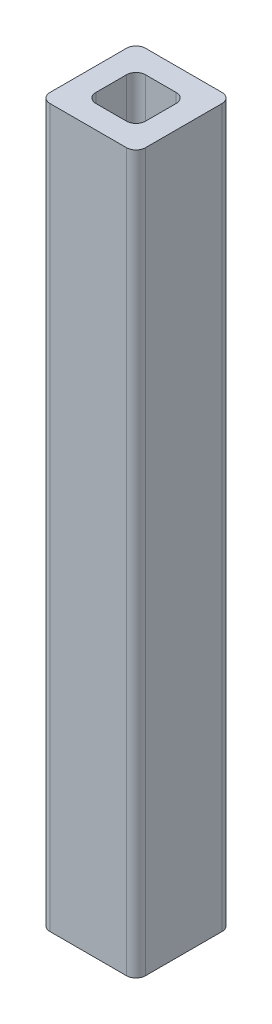
ISO-10303-21;
HEADER;
FILE_DESCRIPTION(('STEP AP214'),'2;1');
FILE_NAME('part.step','',(''),(''),'','','');
FILE_SCHEMA(('AUTOMOTIVE_DESIGN { 1 0 10303 214 1 1 1 1 }'));
ENDSEC;
DATA;
#1=APPLICATION_CONTEXT('core data for automotive mechanical design processes');
#2=APPLICATION_PROTOCOL_DEFINITION('international standard','automotive_design',2000,#1);
#3=PRODUCT_CONTEXT('',#1,'mechanical');
#4=PRODUCT('Part','Part','',(#3));
#5=PRODUCT_RELATED_PRODUCT_CATEGORY('part','',(#4));
#6=PRODUCT_DEFINITION_FORMATION('','',#4);
#7=PRODUCT_DEFINITION_CONTEXT('part definition',#1,'design');
#8=PRODUCT_DEFINITION('design','',#6,#7);
#9=PRODUCT_DEFINITION_SHAPE('','',#8);
#10=(LENGTH_UNIT() NAMED_UNIT(*) SI_UNIT(.MILLI.,.METRE.));
#11=(NAMED_UNIT(*) PLANE_ANGLE_UNIT() SI_UNIT($,.RADIAN.));
#12=(NAMED_UNIT(*) SI_UNIT($,.STERADIAN.) SOLID_ANGLE_UNIT());
#13=UNCERTAINTY_MEASURE_WITH_UNIT(LENGTH_MEASURE(1.E-05),#10,'distance_accuracy_value','');
#14=(GEOMETRIC_REPRESENTATION_CONTEXT(3) GLOBAL_UNCERTAINTY_ASSIGNED_CONTEXT((#13)) GLOBAL_UNIT_ASSIGNED_CONTEXT((#10,
#11,#12)) REPRESENTATION_CONTEXT('',''));
#15=CARTESIAN_POINT('',(0.,0.,0.));
#16=DIRECTION('',(0.,0.,1.));
#17=DIRECTION('',(1.,0.,0.));
#18=AXIS2_PLACEMENT_3D('',#15,#16,#17);
#19=CARTESIAN_POINT('',(4.,75.,-4.));
#20=DIRECTION('',(0.,-1.,0.));
#21=DIRECTION('',(0.,0.,-1.));
#22=AXIS2_PLACEMENT_3D('',#19,#20,#21);
#23=CYLINDRICAL_SURFACE('',#22,1.);
#24=CARTESIAN_POINT('',(4.,0.,-4.));
#25=DIRECTION('',(0.,1.,0.));
#26=DIRECTION('',(0.,0.,-1.));
#27=AXIS2_PLACEMENT_3D('',#24,#25,#26);
#28=CIRCLE('',#27,1.);
#29=CARTESIAN_POINT('',(5.,0.,-3.99999999999999));
#30=VERTEX_POINT('',#29);
#31=CARTESIAN_POINT('',(3.99999999999999,0.,-5.));
#32=VERTEX_POINT('',#31);
#33=EDGE_CURVE('E141',#30,#32,#28,.T.);
#34=ORIENTED_EDGE('',*,*,#33,.T.);
#35=DIRECTION('',(0.,-1.,0.));
#36=VECTOR('',#35,1.);
#37=CARTESIAN_POINT('',(3.99999999999999,75.,-5.));
#38=LINE('',#37,#36);
#39=CARTESIAN_POINT('',(3.99999999999999,75.,-5.));
#40=VERTEX_POINT('',#39);
#41=EDGE_CURVE('E11',#40,#32,#38,.T.);
#42=ORIENTED_EDGE('',*,*,#41,.F.);
#43=CARTESIAN_POINT('',(4.,75.,-4.));
#44=DIRECTION('',(0.,1.,0.));
#45=DIRECTION('',(0.,0.,-1.));
#46=AXIS2_PLACEMENT_3D('',#43,#44,#45);
#47=CIRCLE('',#46,1.);
#48=CARTESIAN_POINT('',(5.,75.,-3.99999999999999));
#49=VERTEX_POINT('',#48);
#50=EDGE_CURVE('E157',#49,#40,#47,.T.);
#51=ORIENTED_EDGE('',*,*,#50,.F.);
#52=DIRECTION('',(0.,-1.,0.));
#53=VECTOR('',#52,1.);
#54=CARTESIAN_POINT('',(5.,75.,-3.99999999999999));
#55=LINE('',#54,#53);
#56=EDGE_CURVE('E137',#49,#30,#55,.T.);
#57=ORIENTED_EDGE('',*,*,#56,.T.);
#58=EDGE_LOOP('',(#34,#42,#51,#57));
#59=FACE_BOUND('',#58,.T.);
#60=ADVANCED_FACE('F33',(#59),#23,.T.);
#61=CARTESIAN_POINT('',(-3.99999999999999,75.,-5.));
#62=DIRECTION('',(0.,0.,1.));
#63=DIRECTION('',(1.,0.,0.));
#64=AXIS2_PLACEMENT_3D('',#61,#62,#63);
#65=PLANE('',#64);
#66=DIRECTION('',(-1.,0.,0.));
#67=VECTOR('',#66,1.);
#68=CARTESIAN_POINT('',(-3.99999999999999,0.,-5.));
#69=LINE('',#68,#67);
#70=CARTESIAN_POINT('',(-3.99999999999999,0.,-5.));
#71=VERTEX_POINT('',#70);
#72=EDGE_CURVE('E144',#32,#71,#69,.T.);
#73=ORIENTED_EDGE('',*,*,#72,.T.);
#74=DIRECTION('',(0.,-1.,0.));
#75=VECTOR('',#74,1.);
#76=CARTESIAN_POINT('',(-3.99999999999999,75.,-5.));
#77=LINE('',#76,#75);
#78=CARTESIAN_POINT('',(-3.99999999999999,75.,-5.));
#79=VERTEX_POINT('',#78);
#80=EDGE_CURVE('E40',#79,#71,#77,.T.);
#81=ORIENTED_EDGE('',*,*,#80,.F.);
#82=DIRECTION('',(-1.,0.,0.));
#83=VECTOR('',#82,1.);
#84=CARTESIAN_POINT('',(-3.99999999999999,75.,-5.));
#85=LINE('',#84,#83);
#86=EDGE_CURVE('E97',#40,#79,#85,.T.);
#87=ORIENTED_EDGE('',*,*,#86,.F.);
#88=ORIENTED_EDGE('',*,*,#41,.T.);
#89=EDGE_LOOP('',(#73,#81,#87,#88));
#90=FACE_BOUND('',#89,.T.);
#91=ADVANCED_FACE('F331',(#90),#65,.F.);
#92=CARTESIAN_POINT('',(-4.,75.,-4.));
#93=DIRECTION('',(0.,-1.,0.));
#94=DIRECTION('',(0.,0.,-1.));
#95=AXIS2_PLACEMENT_3D('',#92,#93,#94);
#96=CYLINDRICAL_SURFACE('',#95,1.);
#97=CARTESIAN_POINT('',(-4.,0.,-4.));
#98=DIRECTION('',(0.,1.,0.));
#99=DIRECTION('',(0.,0.,-1.));
#100=AXIS2_PLACEMENT_3D('',#97,#98,#99);
#101=CIRCLE('',#100,1.);
#102=CARTESIAN_POINT('',(-5.,0.,-3.99999999999999));
#103=VERTEX_POINT('',#102);
#104=EDGE_CURVE('E147',#71,#103,#101,.T.);
#105=ORIENTED_EDGE('',*,*,#104,.T.);
#106=DIRECTION('',(0.,-1.,0.));
#107=VECTOR('',#106,1.);
#108=CARTESIAN_POINT('',(-5.,75.,-3.99999999999999));
#109=LINE('',#108,#107);
#110=CARTESIAN_POINT('',(-5.,75.,-3.99999999999999));
#111=VERTEX_POINT('',#110);
#112=EDGE_CURVE('E164',#111,#103,#109,.T.);
#113=ORIENTED_EDGE('',*,*,#112,.F.);
#114=CARTESIAN_POINT('',(-4.,75.,-4.));
#115=DIRECTION('',(0.,1.,0.));
#116=DIRECTION('',(0.,0.,-1.));
#117=AXIS2_PLACEMENT_3D('',#114,#115,#116);
#118=CIRCLE('',#117,1.);
#119=EDGE_CURVE('E172',#79,#111,#118,.T.);
#120=ORIENTED_EDGE('',*,*,#119,.F.);
#121=ORIENTED_EDGE('',*,*,#80,.T.);
#122=EDGE_LOOP('',(#105,#113,#120,#121));
#123=FACE_BOUND('',#122,.T.);
#124=ADVANCED_FACE('F170',(#123),#96,.T.);
#125=CARTESIAN_POINT('',(-5.,75.,3.99999999999999));
#126=DIRECTION('',(1.,0.,0.));
#127=DIRECTION('',(0.,0.,-1.));
#128=AXIS2_PLACEMENT_3D('',#125,#126,#127);
#129=PLANE('',#128);
#130=DIRECTION('',(0.,0.,1.));
#131=VECTOR('',#130,1.);
#132=CARTESIAN_POINT('',(-5.,0.,3.99999999999999));
#133=LINE('',#132,#131);
#134=CARTESIAN_POINT('',(-5.,0.,3.99999999999999));
#135=VERTEX_POINT('',#134);
#136=EDGE_CURVE('E149',#103,#135,#133,.T.);
#137=ORIENTED_EDGE('',*,*,#136,.T.);
#138=DIRECTION('',(0.,-1.,0.));
#139=VECTOR('',#138,1.);
#140=CARTESIAN_POINT('',(-5.,75.,3.99999999999999));
#141=LINE('',#140,#139);
#142=CARTESIAN_POINT('',(-5.,75.,3.99999999999999));
#143=VERTEX_POINT('',#142);
#144=EDGE_CURVE('E161',#143,#135,#141,.T.);
#145=ORIENTED_EDGE('',*,*,#144,.F.);
#146=DIRECTION('',(0.,0.,1.));
#147=VECTOR('',#146,1.);
#148=CARTESIAN_POINT('',(-5.,75.,3.99999999999999));
#149=LINE('',#148,#147);
#150=EDGE_CURVE('E184',#111,#143,#149,.T.);
#151=ORIENTED_EDGE('',*,*,#150,.F.);
#152=ORIENTED_EDGE('',*,*,#112,.T.);
#153=EDGE_LOOP('',(#137,#145,#151,#152));
#154=FACE_BOUND('',#153,.T.);
#155=ADVANCED_FACE('F180',(#154),#129,.F.);
#156=CARTESIAN_POINT('',(-4.,75.,4.));
#157=DIRECTION('',(0.,-1.,0.));
#158=DIRECTION('',(0.,0.,-1.));
#159=AXIS2_PLACEMENT_3D('',#156,#157,#158);
#160=CYLINDRICAL_SURFACE('',#159,1.);
#161=CARTESIAN_POINT('',(-4.,0.,4.));
#162=DIRECTION('',(0.,1.,0.));
#163=DIRECTION('',(0.,0.,-1.));
#164=AXIS2_PLACEMENT_3D('',#161,#162,#163);
#165=CIRCLE('',#164,1.);
#166=CARTESIAN_POINT('',(-3.99999999999999,0.,5.));
#167=VERTEX_POINT('',#166);
#168=EDGE_CURVE('E151',#135,#167,#165,.T.);
#169=ORIENTED_EDGE('',*,*,#168,.T.);
#170=DIRECTION('',(0.,-1.,0.));
#171=VECTOR('',#170,1.);
#172=CARTESIAN_POINT('',(-3.99999999999999,75.,5.));
#173=LINE('',#172,#171);
#174=CARTESIAN_POINT('',(-3.99999999999999,75.,5.));
#175=VERTEX_POINT('',#174);
#176=EDGE_CURVE('E132',#175,#167,#173,.T.);
#177=ORIENTED_EDGE('',*,*,#176,.F.);
#178=CARTESIAN_POINT('',(-4.,75.,4.));
#179=DIRECTION('',(0.,1.,0.));
#180=DIRECTION('',(0.,0.,-1.));
#181=AXIS2_PLACEMENT_3D('',#178,#179,#180);
#182=CIRCLE('',#181,1.);
#183=EDGE_CURVE('E120',#143,#175,#182,.T.);
#184=ORIENTED_EDGE('',*,*,#183,.F.);
#185=ORIENTED_EDGE('',*,*,#144,.T.);
#186=EDGE_LOOP('',(#169,#177,#184,#185));
#187=FACE_BOUND('',#186,.T.);
#188=ADVANCED_FACE('F183',(#187),#160,.T.);
#189=CARTESIAN_POINT('',(-3.99999999999999,75.,5.));
#190=DIRECTION('',(0.,0.,-1.));
#191=DIRECTION('',(-1.,0.,0.));
#192=AXIS2_PLACEMENT_3D('',#189,#190,#191);
#193=PLANE('',#192);
#194=DIRECTION('',(1.,0.,0.));
#195=VECTOR('',#194,1.);
#196=CARTESIAN_POINT('',(-3.99999999999999,0.,5.));
#197=LINE('',#196,#195);
#198=CARTESIAN_POINT('',(3.99999999999999,0.,5.));
#199=VERTEX_POINT('',#198);
#200=EDGE_CURVE('E129',#167,#199,#197,.T.);
#201=ORIENTED_EDGE('',*,*,#200,.T.);
#202=DIRECTION('',(0.,-1.,0.));
#203=VECTOR('',#202,1.);
#204=CARTESIAN_POINT('',(3.99999999999999,75.,5.));
#205=LINE('',#204,#203);
#206=CARTESIAN_POINT('',(3.99999999999999,75.,5.));
#207=VERTEX_POINT('',#206);
#208=EDGE_CURVE('E126',#207,#199,#205,.T.);
#209=ORIENTED_EDGE('',*,*,#208,.F.);
#210=DIRECTION('',(1.,0.,0.));
#211=VECTOR('',#210,1.);
#212=CARTESIAN_POINT('',(-3.99999999999999,75.,5.));
#213=LINE('',#212,#211);
#214=EDGE_CURVE('E113',#175,#207,#213,.T.);
#215=ORIENTED_EDGE('',*,*,#214,.F.);
#216=ORIENTED_EDGE('',*,*,#176,.T.);
#217=EDGE_LOOP('',(#201,#209,#215,#216));
#218=FACE_BOUND('',#217,.T.);
#219=ADVANCED_FACE('F127',(#218),#193,.F.);
#220=CARTESIAN_POINT('',(4.,75.,4.));
#221=DIRECTION('',(0.,-1.,0.));
#222=DIRECTION('',(0.,0.,-1.));
#223=AXIS2_PLACEMENT_3D('',#220,#221,#222);
#224=CYLINDRICAL_SURFACE('',#223,1.);
#225=CARTESIAN_POINT('',(4.,0.,4.));
#226=DIRECTION('',(0.,1.,0.));
#227=DIRECTION('',(0.,0.,1.));
#228=AXIS2_PLACEMENT_3D('',#225,#226,#227);
#229=CIRCLE('',#228,1.);
#230=CARTESIAN_POINT('',(5.,0.,3.99999999999999));
#231=VERTEX_POINT('',#230);
#232=EDGE_CURVE('E154',#199,#231,#229,.T.);
#233=ORIENTED_EDGE('',*,*,#232,.T.);
#234=DIRECTION('',(0.,-1.,0.));
#235=VECTOR('',#234,1.);
#236=CARTESIAN_POINT('',(5.,75.,3.99999999999999));
#237=LINE('',#236,#235);
#238=CARTESIAN_POINT('',(5.,75.,3.99999999999999));
#239=VERTEX_POINT('',#238);
#240=EDGE_CURVE('E133',#239,#231,#237,.T.);
#241=ORIENTED_EDGE('',*,*,#240,.F.);
#242=CARTESIAN_POINT('',(4.,75.,4.));
#243=DIRECTION('',(0.,1.,0.));
#244=DIRECTION('',(0.,0.,1.));
#245=AXIS2_PLACEMENT_3D('',#242,#243,#244);
#246=CIRCLE('',#245,1.);
#247=EDGE_CURVE('E117',#207,#239,#246,.T.);
#248=ORIENTED_EDGE('',*,*,#247,.F.);
#249=ORIENTED_EDGE('',*,*,#208,.T.);
#250=EDGE_LOOP('',(#233,#241,#248,#249));
#251=FACE_BOUND('',#250,.T.);
#252=ADVANCED_FACE('F135',(#251),#224,.T.);
#253=CARTESIAN_POINT('',(5.,75.,3.99999999999999));
#254=DIRECTION('',(-1.,0.,0.));
#255=DIRECTION('',(0.,0.,1.));
#256=AXIS2_PLACEMENT_3D('',#253,#254,#255);
#257=PLANE('',#256);
#258=DIRECTION('',(0.,0.,-1.));
#259=VECTOR('',#258,1.);
#260=CARTESIAN_POINT('',(5.,0.,3.99999999999999));
#261=LINE('',#260,#259);
#262=EDGE_CURVE('E89',#231,#30,#261,.T.);
#263=ORIENTED_EDGE('',*,*,#262,.T.);
#264=ORIENTED_EDGE('',*,*,#56,.F.);
#265=DIRECTION('',(0.,0.,-1.));
#266=VECTOR('',#265,1.);
#267=CARTESIAN_POINT('',(5.,75.,3.99999999999999));
#268=LINE('',#267,#266);
#269=EDGE_CURVE('E56',#239,#49,#268,.T.);
#270=ORIENTED_EDGE('',*,*,#269,.F.);
#271=ORIENTED_EDGE('',*,*,#240,.T.);
#272=EDGE_LOOP('',(#263,#264,#270,#271));
#273=FACE_BOUND('',#272,.T.);
#274=ADVANCED_FACE('F338',(#273),#257,.F.);
#275=CARTESIAN_POINT('',(4.,75.,-4.));
#276=DIRECTION('',(0.,-1.,0.));
#277=DIRECTION('',(0.,0.,-1.));
#278=AXIS2_PLACEMENT_3D('',#275,#276,#277);
#279=PLANE('',#278);
#280=DIRECTION('',(1.,0.,0.));
#281=VECTOR('',#280,1.);
#282=CARTESIAN_POINT('',(-1.6,75.,2.6));
#283=LINE('',#282,#281);
#284=CARTESIAN_POINT('',(-1.6,75.,2.6));
#285=VERTEX_POINT('',#284);
#286=CARTESIAN_POINT('',(1.6,75.,2.6));
#287=VERTEX_POINT('',#286);
#288=EDGE_CURVE('E231',#285,#287,#283,.T.);
#289=ORIENTED_EDGE('',*,*,#288,.F.);
#290=CARTESIAN_POINT('',(-1.6,75.,1.6));
#291=DIRECTION('',(0.,1.,0.));
#292=DIRECTION('',(0.,0.,-1.));
#293=AXIS2_PLACEMENT_3D('',#290,#291,#292);
#294=CIRCLE('',#293,1.);
#295=CARTESIAN_POINT('',(-2.6,75.,1.6));
#296=VERTEX_POINT('',#295);
#297=EDGE_CURVE('E47',#296,#285,#294,.T.);
#298=ORIENTED_EDGE('',*,*,#297,.F.);
#299=DIRECTION('',(0.,0.,1.));
#300=VECTOR('',#299,1.);
#301=CARTESIAN_POINT('',(-2.6,75.,1.6));
#302=LINE('',#301,#300);
#303=CARTESIAN_POINT('',(-2.6,75.,-1.6));
#304=VERTEX_POINT('',#303);
#305=EDGE_CURVE('E212',#304,#296,#302,.T.);
#306=ORIENTED_EDGE('',*,*,#305,.F.);
#307=CARTESIAN_POINT('',(-1.6,75.,-1.6));
#308=DIRECTION('',(0.,1.,0.));
#309=DIRECTION('',(0.,0.,-1.));
#310=AXIS2_PLACEMENT_3D('',#307,#308,#309);
#311=CIRCLE('',#310,1.);
#312=CARTESIAN_POINT('',(-1.6,75.,-2.6));
#313=VERTEX_POINT('',#312);
#314=EDGE_CURVE('E216',#313,#304,#311,.T.);
#315=ORIENTED_EDGE('',*,*,#314,.F.);
#316=DIRECTION('',(-1.,0.,0.));
#317=VECTOR('',#316,1.);
#318=CARTESIAN_POINT('',(-1.6,75.,-2.6));
#319=LINE('',#318,#317);
#320=CARTESIAN_POINT('',(1.6,75.,-2.6));
#321=VERTEX_POINT('',#320);
#322=EDGE_CURVE('E219',#321,#313,#319,.T.);
#323=ORIENTED_EDGE('',*,*,#322,.F.);
#324=CARTESIAN_POINT('',(1.6,75.,-1.6));
#325=DIRECTION('',(0.,1.,0.));
#326=DIRECTION('',(0.,0.,-1.));
#327=AXIS2_PLACEMENT_3D('',#324,#325,#326);
#328=CIRCLE('',#327,1.);
#329=CARTESIAN_POINT('',(2.6,75.,-1.6));
#330=VERTEX_POINT('',#329);
#331=EDGE_CURVE('E222',#330,#321,#328,.T.);
#332=ORIENTED_EDGE('',*,*,#331,.F.);
#333=DIRECTION('',(0.,0.,-1.));
#334=VECTOR('',#333,1.);
#335=CARTESIAN_POINT('',(2.6,75.,1.6));
#336=LINE('',#335,#334);
#337=CARTESIAN_POINT('',(2.6,75.,1.6));
#338=VERTEX_POINT('',#337);
#339=EDGE_CURVE('E225',#338,#330,#336,.T.);
#340=ORIENTED_EDGE('',*,*,#339,.F.);
#341=CARTESIAN_POINT('',(1.6,75.,1.6));
#342=DIRECTION('',(0.,1.,0.));
#343=DIRECTION('',(0.,0.,1.));
#344=AXIS2_PLACEMENT_3D('',#341,#342,#343);
#345=CIRCLE('',#344,1.);
#346=EDGE_CURVE('E228',#287,#338,#345,.T.);
#347=ORIENTED_EDGE('',*,*,#346,.F.);
#348=EDGE_LOOP('',(#289,#298,#306,#315,#323,#332,#340,#347));
#349=FACE_BOUND('',#348,.T.);
#350=ORIENTED_EDGE('',*,*,#50,.T.);
#351=ORIENTED_EDGE('',*,*,#86,.T.);
#352=ORIENTED_EDGE('',*,*,#119,.T.);
#353=ORIENTED_EDGE('',*,*,#150,.T.);
#354=ORIENTED_EDGE('',*,*,#183,.T.);
#355=ORIENTED_EDGE('',*,*,#214,.T.);
#356=ORIENTED_EDGE('',*,*,#247,.T.);
#357=ORIENTED_EDGE('',*,*,#269,.T.);
#358=EDGE_LOOP('',(#350,#351,#352,#353,#354,#355,#356,#357));
#359=FACE_BOUND('',#358,.T.);
#360=ADVANCED_FACE('F115',(#349,#359),#279,.F.);
#361=CARTESIAN_POINT('',(4.,0.,-4.));
#362=DIRECTION('',(0.,-1.,0.));
#363=DIRECTION('',(0.,0.,-1.));
#364=AXIS2_PLACEMENT_3D('',#361,#362,#363);
#365=PLANE('',#364);
#366=ORIENTED_EDGE('',*,*,#33,.F.);
#367=ORIENTED_EDGE('',*,*,#262,.F.);
#368=ORIENTED_EDGE('',*,*,#232,.F.);
#369=ORIENTED_EDGE('',*,*,#200,.F.);
#370=ORIENTED_EDGE('',*,*,#168,.F.);
#371=ORIENTED_EDGE('',*,*,#136,.F.);
#372=ORIENTED_EDGE('',*,*,#104,.F.);
#373=ORIENTED_EDGE('',*,*,#72,.F.);
#374=EDGE_LOOP('',(#366,#367,#368,#369,#370,#371,#372,#373));
#375=FACE_BOUND('',#374,.T.);
#376=ADVANCED_FACE('F176',(#375),#365,.T.);
#377=CARTESIAN_POINT('',(-1.6,70.,1.6));
#378=DIRECTION('',(0.,1.,0.));
#379=DIRECTION('',(0.,0.,1.));
#380=AXIS2_PLACEMENT_3D('',#377,#378,#379);
#381=CYLINDRICAL_SURFACE('',#380,1.);
#382=ORIENTED_EDGE('',*,*,#297,.T.);
#383=DIRECTION('',(0.,1.,0.));
#384=VECTOR('',#383,1.);
#385=CARTESIAN_POINT('',(-1.6,70.,2.6));
#386=LINE('',#385,#384);
#387=CARTESIAN_POINT('',(-1.6,70.,2.6));
#388=VERTEX_POINT('',#387);
#389=EDGE_CURVE('E190',#388,#285,#386,.T.);
#390=ORIENTED_EDGE('',*,*,#389,.F.);
#391=CARTESIAN_POINT('',(-1.6,70.,1.6));
#392=DIRECTION('',(0.,1.,0.));
#393=DIRECTION('',(0.,0.,-1.));
#394=AXIS2_PLACEMENT_3D('',#391,#392,#393);
#395=CIRCLE('',#394,1.);
#396=CARTESIAN_POINT('',(-2.6,70.,1.6));
#397=VERTEX_POINT('',#396);
#398=EDGE_CURVE('E215',#397,#388,#395,.T.);
#399=ORIENTED_EDGE('',*,*,#398,.F.);
#400=DIRECTION('',(0.,1.,0.));
#401=VECTOR('',#400,1.);
#402=CARTESIAN_POINT('',(-2.6,70.,1.6));
#403=LINE('',#402,#401);
#404=EDGE_CURVE('E145',#397,#296,#403,.T.);
#405=ORIENTED_EDGE('',*,*,#404,.T.);
#406=EDGE_LOOP('',(#382,#390,#399,#405));
#407=FACE_BOUND('',#406,.T.);
#408=ADVANCED_FACE('F264',(#407),#381,.F.);
#409=CARTESIAN_POINT('',(-2.6,70.,1.6));
#410=DIRECTION('',(-1.,0.,0.));
#411=DIRECTION('',(0.,0.,1.));
#412=AXIS2_PLACEMENT_3D('',#409,#410,#411);
#413=PLANE('',#412);
#414=ORIENTED_EDGE('',*,*,#305,.T.);
#415=ORIENTED_EDGE('',*,*,#404,.F.);
#416=DIRECTION('',(0.,0.,1.));
#417=VECTOR('',#416,1.);
#418=CARTESIAN_POINT('',(-2.6,70.,1.6));
#419=LINE('',#418,#417);
#420=CARTESIAN_POINT('',(-2.6,70.,-1.6));
#421=VERTEX_POINT('',#420);
#422=EDGE_CURVE('E193',#421,#397,#419,.T.);
#423=ORIENTED_EDGE('',*,*,#422,.F.);
#424=DIRECTION('',(0.,1.,0.));
#425=VECTOR('',#424,1.);
#426=CARTESIAN_POINT('',(-2.6,70.,-1.6));
#427=LINE('',#426,#425);
#428=EDGE_CURVE('E208',#421,#304,#427,.T.);
#429=ORIENTED_EDGE('',*,*,#428,.T.);
#430=EDGE_LOOP('',(#414,#415,#423,#429));
#431=FACE_BOUND('',#430,.T.);
#432=ADVANCED_FACE('F284',(#431),#413,.F.);
#433=CARTESIAN_POINT('',(-1.6,70.,-1.6));
#434=DIRECTION('',(0.,1.,0.));
#435=DIRECTION('',(0.,0.,1.));
#436=AXIS2_PLACEMENT_3D('',#433,#434,#435);
#437=CYLINDRICAL_SURFACE('',#436,1.);
#438=ORIENTED_EDGE('',*,*,#314,.T.);
#439=ORIENTED_EDGE('',*,*,#428,.F.);
#440=CARTESIAN_POINT('',(-1.6,70.,-1.6));
#441=DIRECTION('',(0.,1.,0.));
#442=DIRECTION('',(0.,0.,-1.));
#443=AXIS2_PLACEMENT_3D('',#440,#441,#442);
#444=CIRCLE('',#443,1.);
#445=CARTESIAN_POINT('',(-1.6,70.,-2.6));
#446=VERTEX_POINT('',#445);
#447=EDGE_CURVE('E237',#446,#421,#444,.T.);
#448=ORIENTED_EDGE('',*,*,#447,.F.);
#449=DIRECTION('',(0.,1.,0.));
#450=VECTOR('',#449,1.);
#451=CARTESIAN_POINT('',(-1.6,70.,-2.6));
#452=LINE('',#451,#450);
#453=EDGE_CURVE('E205',#446,#313,#452,.T.);
#454=ORIENTED_EDGE('',*,*,#453,.T.);
#455=EDGE_LOOP('',(#438,#439,#448,#454));
#456=FACE_BOUND('',#455,.T.);
#457=ADVANCED_FACE('F289',(#456),#437,.F.);
#458=CARTESIAN_POINT('',(-1.6,70.,-2.6));
#459=DIRECTION('',(0.,0.,-1.));
#460=DIRECTION('',(-1.,0.,0.));
#461=AXIS2_PLACEMENT_3D('',#458,#459,#460);
#462=PLANE('',#461);
#463=ORIENTED_EDGE('',*,*,#322,.T.);
#464=ORIENTED_EDGE('',*,*,#453,.F.);
#465=DIRECTION('',(-1.,0.,0.));
#466=VECTOR('',#465,1.);
#467=CARTESIAN_POINT('',(-1.6,70.,-2.6));
#468=LINE('',#467,#466);
#469=CARTESIAN_POINT('',(1.6,70.,-2.6));
#470=VERTEX_POINT('',#469);
#471=EDGE_CURVE('E240',#470,#446,#468,.T.);
#472=ORIENTED_EDGE('',*,*,#471,.F.);
#473=DIRECTION('',(0.,1.,0.));
#474=VECTOR('',#473,1.);
#475=CARTESIAN_POINT('',(1.6,70.,-2.6));
#476=LINE('',#475,#474);
#477=EDGE_CURVE('E202',#470,#321,#476,.T.);
#478=ORIENTED_EDGE('',*,*,#477,.T.);
#479=EDGE_LOOP('',(#463,#464,#472,#478));
#480=FACE_BOUND('',#479,.T.);
#481=ADVANCED_FACE('F315',(#480),#462,.F.);
#482=CARTESIAN_POINT('',(1.6,70.,-1.6));
#483=DIRECTION('',(0.,1.,0.));
#484=DIRECTION('',(0.,0.,1.));
#485=AXIS2_PLACEMENT_3D('',#482,#483,#484);
#486=CYLINDRICAL_SURFACE('',#485,1.);
#487=ORIENTED_EDGE('',*,*,#331,.T.);
#488=ORIENTED_EDGE('',*,*,#477,.F.);
#489=CARTESIAN_POINT('',(1.6,70.,-1.6));
#490=DIRECTION('',(0.,1.,0.));
#491=DIRECTION('',(0.,0.,-1.));
#492=AXIS2_PLACEMENT_3D('',#489,#490,#491);
#493=CIRCLE('',#492,1.);
#494=CARTESIAN_POINT('',(2.6,70.,-1.6));
#495=VERTEX_POINT('',#494);
#496=EDGE_CURVE('E243',#495,#470,#493,.T.);
#497=ORIENTED_EDGE('',*,*,#496,.F.);
#498=DIRECTION('',(0.,1.,0.));
#499=VECTOR('',#498,1.);
#500=CARTESIAN_POINT('',(2.6,70.,-1.6));
#501=LINE('',#500,#499);
#502=EDGE_CURVE('E199',#495,#330,#501,.T.);
#503=ORIENTED_EDGE('',*,*,#502,.T.);
#504=EDGE_LOOP('',(#487,#488,#497,#503));
#505=FACE_BOUND('',#504,.T.);
#506=ADVANCED_FACE('F318',(#505),#486,.F.);
#507=CARTESIAN_POINT('',(2.6,70.,1.6));
#508=DIRECTION('',(1.,0.,0.));
#509=DIRECTION('',(0.,0.,-1.));
#510=AXIS2_PLACEMENT_3D('',#507,#508,#509);
#511=PLANE('',#510);
#512=ORIENTED_EDGE('',*,*,#339,.T.);
#513=ORIENTED_EDGE('',*,*,#502,.F.);
#514=DIRECTION('',(0.,0.,-1.));
#515=VECTOR('',#514,1.);
#516=CARTESIAN_POINT('',(2.6,70.,1.6));
#517=LINE('',#516,#515);
#518=CARTESIAN_POINT('',(2.6,70.,1.6));
#519=VERTEX_POINT('',#518);
#520=EDGE_CURVE('E246',#519,#495,#517,.T.);
#521=ORIENTED_EDGE('',*,*,#520,.F.);
#522=DIRECTION('',(0.,1.,0.));
#523=VECTOR('',#522,1.);
#524=CARTESIAN_POINT('',(2.6,70.,1.6));
#525=LINE('',#524,#523);
#526=EDGE_CURVE('E196',#519,#338,#525,.T.);
#527=ORIENTED_EDGE('',*,*,#526,.T.);
#528=EDGE_LOOP('',(#512,#513,#521,#527));
#529=FACE_BOUND('',#528,.T.);
#530=ADVANCED_FACE('F321',(#529),#511,.F.);
#531=CARTESIAN_POINT('',(1.6,70.,1.6));
#532=DIRECTION('',(0.,1.,0.));
#533=DIRECTION('',(0.,0.,1.));
#534=AXIS2_PLACEMENT_3D('',#531,#532,#533);
#535=CYLINDRICAL_SURFACE('',#534,1.);
#536=ORIENTED_EDGE('',*,*,#346,.T.);
#537=ORIENTED_EDGE('',*,*,#526,.F.);
#538=CARTESIAN_POINT('',(1.6,70.,1.6));
#539=DIRECTION('',(0.,1.,0.));
#540=DIRECTION('',(0.,0.,1.));
#541=AXIS2_PLACEMENT_3D('',#538,#539,#540);
#542=CIRCLE('',#541,1.);
#543=CARTESIAN_POINT('',(1.6,70.,2.6));
#544=VERTEX_POINT('',#543);
#545=EDGE_CURVE('E249',#544,#519,#542,.T.);
#546=ORIENTED_EDGE('',*,*,#545,.F.);
#547=DIRECTION('',(0.,1.,0.));
#548=VECTOR('',#547,1.);
#549=CARTESIAN_POINT('',(1.6,70.,2.6));
#550=LINE('',#549,#548);
#551=EDGE_CURVE('E192',#544,#287,#550,.T.);
#552=ORIENTED_EDGE('',*,*,#551,.T.);
#553=EDGE_LOOP('',(#536,#537,#546,#552));
#554=FACE_BOUND('',#553,.T.);
#555=ADVANCED_FACE('F304',(#554),#535,.F.);
#556=CARTESIAN_POINT('',(-1.6,70.,2.6));
#557=DIRECTION('',(0.,0.,1.));
#558=DIRECTION('',(1.,0.,0.));
#559=AXIS2_PLACEMENT_3D('',#556,#557,#558);
#560=PLANE('',#559);
#561=ORIENTED_EDGE('',*,*,#288,.T.);
#562=ORIENTED_EDGE('',*,*,#551,.F.);
#563=DIRECTION('',(1.,0.,0.));
#564=VECTOR('',#563,1.);
#565=CARTESIAN_POINT('',(-1.6,70.,2.6));
#566=LINE('',#565,#564);
#567=EDGE_CURVE('E252',#388,#544,#566,.T.);
#568=ORIENTED_EDGE('',*,*,#567,.F.);
#569=ORIENTED_EDGE('',*,*,#389,.T.);
#570=EDGE_LOOP('',(#561,#562,#568,#569));
#571=FACE_BOUND('',#570,.T.);
#572=ADVANCED_FACE('F298',(#571),#560,.F.);
#573=CARTESIAN_POINT('',(-1.6,70.,1.6));
#574=DIRECTION('',(0.,-1.,0.));
#575=DIRECTION('',(0.,0.,-1.));
#576=AXIS2_PLACEMENT_3D('',#573,#574,#575);
#577=PLANE('',#576);
#578=ORIENTED_EDGE('',*,*,#398,.T.);
#579=ORIENTED_EDGE('',*,*,#567,.T.);
#580=ORIENTED_EDGE('',*,*,#545,.T.);
#581=ORIENTED_EDGE('',*,*,#520,.T.);
#582=ORIENTED_EDGE('',*,*,#496,.T.);
#583=ORIENTED_EDGE('',*,*,#471,.T.);
#584=ORIENTED_EDGE('',*,*,#447,.T.);
#585=ORIENTED_EDGE('',*,*,#422,.T.);
#586=EDGE_LOOP('',(#578,#579,#580,#581,#582,#583,#584,#585));
#587=FACE_BOUND('',#586,.T.);
#588=ADVANCED_FACE('F259',(#587),#577,.F.);
#589=CLOSED_SHELL('',(#60,#91,#124,#155,#188,#219,#252,#274,#360,#376,#408,#432,#457,#481,#506,
#530,#555,#572,#588));
#590=MANIFOLD_SOLID_BREP('B2',#589);
#591=ADVANCED_BREP_SHAPE_REPRESENTATION('',(#18,#590),#14);
#592=SHAPE_DEFINITION_REPRESENTATION(#9,#591);
ENDSEC;
END-ISO-10303-21;
